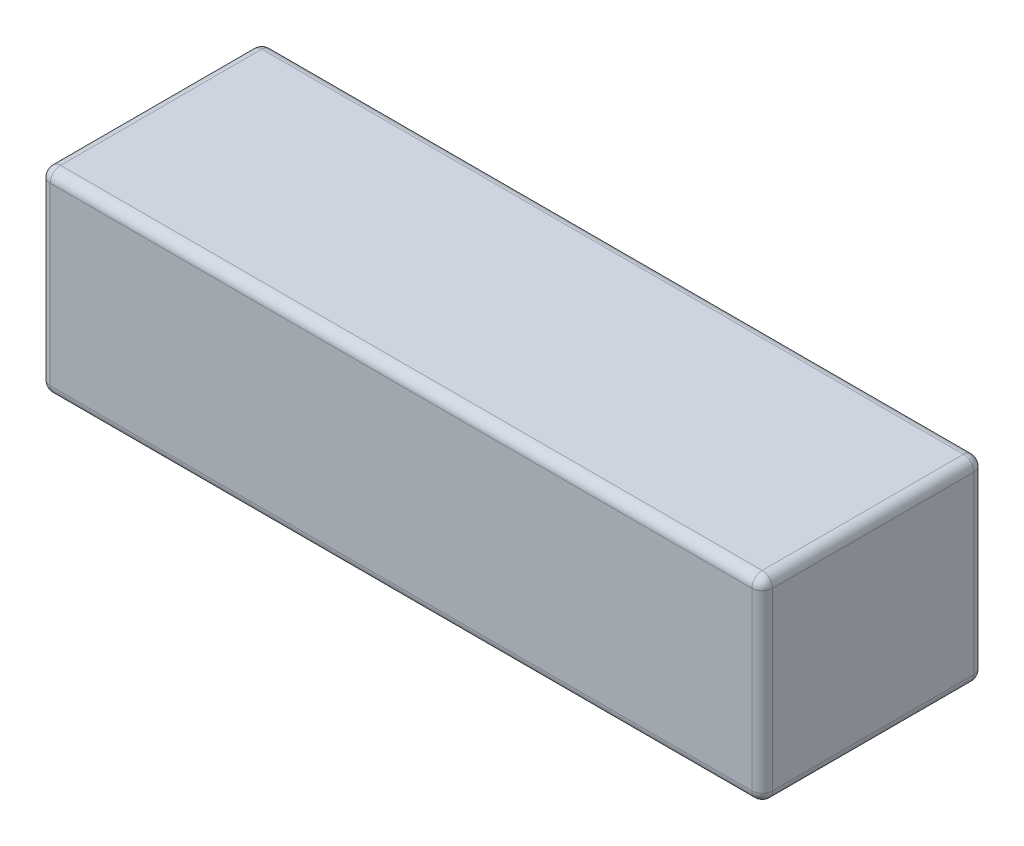
ISO-10303-21;
HEADER;
FILE_DESCRIPTION(('STEP AP214'),'2;1');
FILE_NAME('part.step','',(''),(''),'','','');
FILE_SCHEMA(('AUTOMOTIVE_DESIGN { 1 0 10303 214 1 1 1 1 }'));
ENDSEC;
DATA;
#1=APPLICATION_CONTEXT('core data for automotive mechanical design processes');
#2=APPLICATION_PROTOCOL_DEFINITION('international standard','automotive_design',2000,#1);
#3=PRODUCT_CONTEXT('',#1,'mechanical');
#4=PRODUCT('Part','Part','',(#3));
#5=PRODUCT_RELATED_PRODUCT_CATEGORY('part','',(#4));
#6=PRODUCT_DEFINITION_FORMATION('','',#4);
#7=PRODUCT_DEFINITION_CONTEXT('part definition',#1,'design');
#8=PRODUCT_DEFINITION('design','',#6,#7);
#9=PRODUCT_DEFINITION_SHAPE('','',#8);
#10=(LENGTH_UNIT() NAMED_UNIT(*) SI_UNIT(.MILLI.,.METRE.));
#11=(NAMED_UNIT(*) PLANE_ANGLE_UNIT() SI_UNIT($,.RADIAN.));
#12=(NAMED_UNIT(*) SI_UNIT($,.STERADIAN.) SOLID_ANGLE_UNIT());
#13=UNCERTAINTY_MEASURE_WITH_UNIT(LENGTH_MEASURE(1.E-05),#10,'distance_accuracy_value','');
#14=(GEOMETRIC_REPRESENTATION_CONTEXT(3) GLOBAL_UNCERTAINTY_ASSIGNED_CONTEXT((#13)) GLOBAL_UNIT_ASSIGNED_CONTEXT((#10,
#11,#12)) REPRESENTATION_CONTEXT('',''));
#15=CARTESIAN_POINT('',(0.,0.,0.));
#16=DIRECTION('',(0.,0.,1.));
#17=DIRECTION('',(1.,0.,0.));
#18=AXIS2_PLACEMENT_3D('',#15,#16,#17);
#19=CARTESIAN_POINT('',(70.,38.,21.5));
#20=DIRECTION('',(-1.,0.,0.));
#21=DIRECTION('',(0.,0.,1.));
#22=AXIS2_PLACEMENT_3D('',#19,#20,#21);
#23=PLANE('',#22);
#24=DIRECTION('',(0.,0.,-1.));
#25=VECTOR('',#24,1.);
#26=CARTESIAN_POINT('',(70.,36.,21.5));
#27=LINE('',#26,#25);
#28=CARTESIAN_POINT('',(70.,36.,-19.5));
#29=VERTEX_POINT('',#28);
#30=CARTESIAN_POINT('',(70.,36.,19.5));
#31=VERTEX_POINT('',#30);
#32=EDGE_CURVE('E194',#29,#31,#27,.F.);
#33=ORIENTED_EDGE('',*,*,#32,.T.);
#34=DIRECTION('',(0.,-1.,0.));
#35=VECTOR('',#34,1.);
#36=CARTESIAN_POINT('',(70.,38.,19.5));
#37=LINE('',#36,#35);
#38=CARTESIAN_POINT('',(70.,2.,19.5));
#39=VERTEX_POINT('',#38);
#40=EDGE_CURVE('E196',#31,#39,#37,.T.);
#41=ORIENTED_EDGE('',*,*,#40,.T.);
#42=DIRECTION('',(0.,0.,-1.));
#43=VECTOR('',#42,1.);
#44=CARTESIAN_POINT('',(70.,2.,-21.5));
#45=LINE('',#44,#43);
#46=CARTESIAN_POINT('',(70.,2.,-19.5));
#47=VERTEX_POINT('',#46);
#48=EDGE_CURVE('E190',#39,#47,#45,.T.);
#49=ORIENTED_EDGE('',*,*,#48,.T.);
#50=DIRECTION('',(0.,-1.,0.));
#51=VECTOR('',#50,1.);
#52=CARTESIAN_POINT('',(70.,38.,-19.5));
#53=LINE('',#52,#51);
#54=EDGE_CURVE('E192',#47,#29,#53,.F.);
#55=ORIENTED_EDGE('',*,*,#54,.T.);
#56=EDGE_LOOP('',(#33,#41,#49,#55));
#57=FACE_BOUND('',#56,.T.);
#58=ADVANCED_FACE('F34',(#57),#23,.F.);
#59=CARTESIAN_POINT('',(-70.,38.,-21.5));
#60=DIRECTION('',(0.,0.,1.));
#61=DIRECTION('',(1.,0.,0.));
#62=AXIS2_PLACEMENT_3D('',#59,#60,#61);
#63=PLANE('',#62);
#64=DIRECTION('',(-1.,0.,0.));
#65=VECTOR('',#64,1.);
#66=CARTESIAN_POINT('',(-70.,36.,-21.5));
#67=LINE('',#66,#65);
#68=CARTESIAN_POINT('',(-68.,36.,-21.5));
#69=VERTEX_POINT('',#68);
#70=CARTESIAN_POINT('',(68.,36.,-21.5));
#71=VERTEX_POINT('',#70);
#72=EDGE_CURVE('E141',#69,#71,#67,.F.);
#73=ORIENTED_EDGE('',*,*,#72,.T.);
#74=DIRECTION('',(0.,-1.,0.));
#75=VECTOR('',#74,1.);
#76=CARTESIAN_POINT('',(68.,38.,-21.5));
#77=LINE('',#76,#75);
#78=CARTESIAN_POINT('',(68.,2.,-21.5));
#79=VERTEX_POINT('',#78);
#80=EDGE_CURVE('E188',#71,#79,#77,.T.);
#81=ORIENTED_EDGE('',*,*,#80,.T.);
#82=DIRECTION('',(-1.,0.,0.));
#83=VECTOR('',#82,1.);
#84=CARTESIAN_POINT('',(-70.,2.,-21.5));
#85=LINE('',#84,#83);
#86=CARTESIAN_POINT('',(-68.,2.,-21.5));
#87=VERTEX_POINT('',#86);
#88=EDGE_CURVE('E185',#79,#87,#85,.T.);
#89=ORIENTED_EDGE('',*,*,#88,.T.);
#90=DIRECTION('',(0.,-1.,0.));
#91=VECTOR('',#90,1.);
#92=CARTESIAN_POINT('',(-68.,38.,-21.5));
#93=LINE('',#92,#91);
#94=EDGE_CURVE('E183',#87,#69,#93,.F.);
#95=ORIENTED_EDGE('',*,*,#94,.T.);
#96=EDGE_LOOP('',(#73,#81,#89,#95));
#97=FACE_BOUND('',#96,.T.);
#98=ADVANCED_FACE('F296',(#97),#63,.F.);
#99=CARTESIAN_POINT('',(-70.,38.,21.5));
#100=DIRECTION('',(1.,0.,0.));
#101=DIRECTION('',(0.,0.,-1.));
#102=AXIS2_PLACEMENT_3D('',#99,#100,#101);
#103=PLANE('',#102);
#104=DIRECTION('',(0.,0.,1.));
#105=VECTOR('',#104,1.);
#106=CARTESIAN_POINT('',(-70.,36.,21.5));
#107=LINE('',#106,#105);
#108=CARTESIAN_POINT('',(-70.,36.,19.5));
#109=VERTEX_POINT('',#108);
#110=CARTESIAN_POINT('',(-70.,36.,-19.5));
#111=VERTEX_POINT('',#110);
#112=EDGE_CURVE('E43',#109,#111,#107,.F.);
#113=ORIENTED_EDGE('',*,*,#112,.T.);
#114=DIRECTION('',(0.,-1.,0.));
#115=VECTOR('',#114,1.);
#116=CARTESIAN_POINT('',(-70.,38.,-19.5));
#117=LINE('',#116,#115);
#118=CARTESIAN_POINT('',(-70.,2.,-19.5));
#119=VERTEX_POINT('',#118);
#120=EDGE_CURVE('E11',#111,#119,#117,.T.);
#121=ORIENTED_EDGE('',*,*,#120,.T.);
#122=DIRECTION('',(0.,0.,1.));
#123=VECTOR('',#122,1.);
#124=CARTESIAN_POINT('',(-70.,2.,21.5));
#125=LINE('',#124,#123);
#126=CARTESIAN_POINT('',(-70.,2.,19.5));
#127=VERTEX_POINT('',#126);
#128=EDGE_CURVE('E199',#119,#127,#125,.T.);
#129=ORIENTED_EDGE('',*,*,#128,.T.);
#130=DIRECTION('',(0.,-1.,0.));
#131=VECTOR('',#130,1.);
#132=CARTESIAN_POINT('',(-70.,38.,19.5));
#133=LINE('',#132,#131);
#134=EDGE_CURVE('E54',#127,#109,#133,.F.);
#135=ORIENTED_EDGE('',*,*,#134,.T.);
#136=EDGE_LOOP('',(#113,#121,#129,#135));
#137=FACE_BOUND('',#136,.T.);
#138=ADVANCED_FACE('F298',(#137),#103,.F.);
#139=CARTESIAN_POINT('',(-70.,38.,21.5));
#140=DIRECTION('',(0.,0.,-1.));
#141=DIRECTION('',(-1.,0.,0.));
#142=AXIS2_PLACEMENT_3D('',#139,#140,#141);
#143=PLANE('',#142);
#144=DIRECTION('',(1.,0.,0.));
#145=VECTOR('',#144,1.);
#146=CARTESIAN_POINT('',(70.,2.,21.5));
#147=LINE('',#146,#145);
#148=CARTESIAN_POINT('',(-68.,2.,21.5));
#149=VERTEX_POINT('',#148);
#150=CARTESIAN_POINT('',(68.,2.,21.5));
#151=VERTEX_POINT('',#150);
#152=EDGE_CURVE('E167',#149,#151,#147,.T.);
#153=ORIENTED_EDGE('',*,*,#152,.T.);
#154=DIRECTION('',(0.,-1.,0.));
#155=VECTOR('',#154,1.);
#156=CARTESIAN_POINT('',(68.,38.,21.5));
#157=LINE('',#156,#155);
#158=CARTESIAN_POINT('',(68.,36.,21.5));
#159=VERTEX_POINT('',#158);
#160=EDGE_CURVE('E172',#151,#159,#157,.F.);
#161=ORIENTED_EDGE('',*,*,#160,.T.);
#162=DIRECTION('',(1.,0.,0.));
#163=VECTOR('',#162,1.);
#164=CARTESIAN_POINT('',(-70.,36.,21.5));
#165=LINE('',#164,#163);
#166=CARTESIAN_POINT('',(-68.,36.,21.5));
#167=VERTEX_POINT('',#166);
#168=EDGE_CURVE('E169',#159,#167,#165,.F.);
#169=ORIENTED_EDGE('',*,*,#168,.T.);
#170=DIRECTION('',(0.,-1.,0.));
#171=VECTOR('',#170,1.);
#172=CARTESIAN_POINT('',(-68.,38.,21.5));
#173=LINE('',#172,#171);
#174=EDGE_CURVE('E165',#167,#149,#173,.T.);
#175=ORIENTED_EDGE('',*,*,#174,.T.);
#176=EDGE_LOOP('',(#153,#161,#169,#175));
#177=FACE_BOUND('',#176,.T.);
#178=ADVANCED_FACE('F304',(#177),#143,.F.);
#179=CARTESIAN_POINT('',(0.,38.,0.));
#180=DIRECTION('',(0.,-1.,0.));
#181=DIRECTION('',(0.,0.,-1.));
#182=AXIS2_PLACEMENT_3D('',#179,#180,#181);
#183=PLANE('',#182);
#184=DIRECTION('',(1.,0.,0.));
#185=VECTOR('',#184,1.);
#186=CARTESIAN_POINT('',(0.,38.,19.5));
#187=LINE('',#186,#185);
#188=CARTESIAN_POINT('',(-68.,38.,19.5));
#189=VERTEX_POINT('',#188);
#190=CARTESIAN_POINT('',(68.,38.,19.5));
#191=VERTEX_POINT('',#190);
#192=EDGE_CURVE('E133',#189,#191,#187,.T.);
#193=ORIENTED_EDGE('',*,*,#192,.T.);
#194=DIRECTION('',(0.,0.,-1.));
#195=VECTOR('',#194,1.);
#196=CARTESIAN_POINT('',(68.,38.,0.));
#197=LINE('',#196,#195);
#198=CARTESIAN_POINT('',(68.,38.,-19.5));
#199=VERTEX_POINT('',#198);
#200=EDGE_CURVE('E129',#191,#199,#197,.T.);
#201=ORIENTED_EDGE('',*,*,#200,.T.);
#202=DIRECTION('',(-1.,0.,0.));
#203=VECTOR('',#202,1.);
#204=CARTESIAN_POINT('',(0.,38.,-19.5));
#205=LINE('',#204,#203);
#206=CARTESIAN_POINT('',(-68.,38.,-19.5));
#207=VERTEX_POINT('',#206);
#208=EDGE_CURVE('E121',#199,#207,#205,.T.);
#209=ORIENTED_EDGE('',*,*,#208,.T.);
#210=DIRECTION('',(0.,0.,1.));
#211=VECTOR('',#210,1.);
#212=CARTESIAN_POINT('',(-68.,38.,0.));
#213=LINE('',#212,#211);
#214=EDGE_CURVE('E126',#207,#189,#213,.T.);
#215=ORIENTED_EDGE('',*,*,#214,.T.);
#216=EDGE_LOOP('',(#193,#201,#209,#215));
#217=FACE_BOUND('',#216,.T.);
#218=ADVANCED_FACE('F124',(#217),#183,.F.);
#219=CARTESIAN_POINT('',(0.,0.,0.));
#220=DIRECTION('',(0.,-1.,0.));
#221=DIRECTION('',(0.,0.,-1.));
#222=AXIS2_PLACEMENT_3D('',#219,#220,#221);
#223=PLANE('',#222);
#224=DIRECTION('',(-1.,0.,0.));
#225=VECTOR('',#224,1.);
#226=CARTESIAN_POINT('',(70.,0.,-19.5));
#227=LINE('',#226,#225);
#228=CARTESIAN_POINT('',(-68.,0.,-19.5));
#229=VERTEX_POINT('',#228);
#230=CARTESIAN_POINT('',(68.,0.,-19.5));
#231=VERTEX_POINT('',#230);
#232=EDGE_CURVE('E176',#229,#231,#227,.F.);
#233=ORIENTED_EDGE('',*,*,#232,.T.);
#234=DIRECTION('',(0.,0.,-1.));
#235=VECTOR('',#234,1.);
#236=CARTESIAN_POINT('',(68.,0.,21.5));
#237=LINE('',#236,#235);
#238=CARTESIAN_POINT('',(68.,0.,19.5));
#239=VERTEX_POINT('',#238);
#240=EDGE_CURVE('E181',#231,#239,#237,.F.);
#241=ORIENTED_EDGE('',*,*,#240,.T.);
#242=DIRECTION('',(1.,0.,0.));
#243=VECTOR('',#242,1.);
#244=CARTESIAN_POINT('',(-70.,0.,19.5));
#245=LINE('',#244,#243);
#246=CARTESIAN_POINT('',(-68.,0.,19.5));
#247=VERTEX_POINT('',#246);
#248=EDGE_CURVE('E178',#239,#247,#245,.F.);
#249=ORIENTED_EDGE('',*,*,#248,.T.);
#250=DIRECTION('',(0.,0.,1.));
#251=VECTOR('',#250,1.);
#252=CARTESIAN_POINT('',(-68.,0.,-21.5));
#253=LINE('',#252,#251);
#254=EDGE_CURVE('E174',#247,#229,#253,.F.);
#255=ORIENTED_EDGE('',*,*,#254,.T.);
#256=EDGE_LOOP('',(#233,#241,#249,#255));
#257=FACE_BOUND('',#256,.T.);
#258=ADVANCED_FACE('F274',(#257),#223,.T.);
#259=CARTESIAN_POINT('',(-70.,2.,-19.5));
#260=DIRECTION('',(1.,0.,0.));
#261=DIRECTION('',(0.,0.,-1.));
#262=AXIS2_PLACEMENT_3D('',#259,#260,#261);
#263=CYLINDRICAL_SURFACE('',#262,2.);
#264=CARTESIAN_POINT('',(-68.,2.,-19.5));
#265=DIRECTION('',(-1.,0.,0.));
#266=DIRECTION('',(0.,0.,1.));
#267=AXIS2_PLACEMENT_3D('',#264,#265,#266);
#268=CIRCLE('',#267,2.);
#269=EDGE_CURVE('E38',#87,#229,#268,.T.);
#270=ORIENTED_EDGE('',*,*,#269,.F.);
#271=ORIENTED_EDGE('',*,*,#88,.F.);
#272=CARTESIAN_POINT('',(68.,2.,-19.5));
#273=DIRECTION('',(1.,0.,0.));
#274=DIRECTION('',(0.,0.,-1.));
#275=AXIS2_PLACEMENT_3D('',#272,#273,#274);
#276=CIRCLE('',#275,2.);
#277=EDGE_CURVE('E161',#231,#79,#276,.T.);
#278=ORIENTED_EDGE('',*,*,#277,.F.);
#279=ORIENTED_EDGE('',*,*,#232,.F.);
#280=EDGE_LOOP('',(#270,#271,#278,#279));
#281=FACE_BOUND('',#280,.T.);
#282=ADVANCED_FACE('F36',(#281),#263,.T.);
#283=CARTESIAN_POINT('',(-68.,2.,-19.5));
#284=DIRECTION('',(0.,-1.,0.));
#285=DIRECTION('',(0.,0.,-1.));
#286=AXIS2_PLACEMENT_3D('',#283,#284,#285);
#287=SPHERICAL_SURFACE('',#286,2.);
#288=CARTESIAN_POINT('',(-68.,2.,-19.5));
#289=DIRECTION('',(0.,-1.,0.));
#290=DIRECTION('',(0.,0.,-1.));
#291=AXIS2_PLACEMENT_3D('',#288,#289,#290);
#292=CIRCLE('',#291,2.);
#293=EDGE_CURVE('E244',#87,#119,#292,.F.);
#294=ORIENTED_EDGE('',*,*,#293,.F.);
#295=ORIENTED_EDGE('',*,*,#269,.T.);
#296=CARTESIAN_POINT('',(-68.,2.,-19.5));
#297=DIRECTION('',(0.,0.,-1.));
#298=DIRECTION('',(-1.,0.,0.));
#299=AXIS2_PLACEMENT_3D('',#296,#297,#298);
#300=CIRCLE('',#299,2.);
#301=EDGE_CURVE('E247',#119,#229,#300,.F.);
#302=ORIENTED_EDGE('',*,*,#301,.F.);
#303=EDGE_LOOP('',(#294,#295,#302));
#304=FACE_BOUND('',#303,.T.);
#305=ADVANCED_FACE('F291',(#304),#287,.T.);
#306=CARTESIAN_POINT('',(68.,2.,-19.5));
#307=DIRECTION('',(0.,0.,-1.));
#308=DIRECTION('',(0.,1.,0.));
#309=AXIS2_PLACEMENT_3D('',#306,#307,#308);
#310=SPHERICAL_SURFACE('',#309,2.);
#311=CARTESIAN_POINT('',(68.,2.,-19.5));
#312=DIRECTION('',(0.,0.,-1.));
#313=DIRECTION('',(-1.,0.,0.));
#314=AXIS2_PLACEMENT_3D('',#311,#312,#313);
#315=CIRCLE('',#314,2.);
#316=EDGE_CURVE('E238',#231,#47,#315,.F.);
#317=ORIENTED_EDGE('',*,*,#316,.F.);
#318=ORIENTED_EDGE('',*,*,#277,.T.);
#319=CARTESIAN_POINT('',(68.,2.,-19.5));
#320=DIRECTION('',(0.,-1.,0.));
#321=DIRECTION('',(0.,0.,-1.));
#322=AXIS2_PLACEMENT_3D('',#319,#320,#321);
#323=CIRCLE('',#322,2.);
#324=EDGE_CURVE('E241',#47,#79,#323,.F.);
#325=ORIENTED_EDGE('',*,*,#324,.F.);
#326=EDGE_LOOP('',(#317,#318,#325));
#327=FACE_BOUND('',#326,.T.);
#328=ADVANCED_FACE('F254',(#327),#310,.T.);
#329=CARTESIAN_POINT('',(-68.,2.,21.5));
#330=DIRECTION('',(0.,0.,-1.));
#331=DIRECTION('',(-1.,0.,0.));
#332=AXIS2_PLACEMENT_3D('',#329,#330,#331);
#333=CYLINDRICAL_SURFACE('',#332,2.);
#334=ORIENTED_EDGE('',*,*,#301,.T.);
#335=ORIENTED_EDGE('',*,*,#254,.F.);
#336=CARTESIAN_POINT('',(-68.,2.,19.5));
#337=DIRECTION('',(0.,0.,1.));
#338=DIRECTION('',(1.,0.,0.));
#339=AXIS2_PLACEMENT_3D('',#336,#337,#338);
#340=CIRCLE('',#339,2.);
#341=EDGE_CURVE('E233',#127,#247,#340,.T.);
#342=ORIENTED_EDGE('',*,*,#341,.F.);
#343=ORIENTED_EDGE('',*,*,#128,.F.);
#344=EDGE_LOOP('',(#334,#335,#342,#343));
#345=FACE_BOUND('',#344,.T.);
#346=ADVANCED_FACE('F286',(#345),#333,.T.);
#347=CARTESIAN_POINT('',(-68.,38.,-19.5));
#348=DIRECTION('',(0.,-1.,0.));
#349=DIRECTION('',(0.,0.,-1.));
#350=AXIS2_PLACEMENT_3D('',#347,#348,#349);
#351=CYLINDRICAL_SURFACE('',#350,2.);
#352=ORIENTED_EDGE('',*,*,#293,.T.);
#353=ORIENTED_EDGE('',*,*,#120,.F.);
#354=CARTESIAN_POINT('',(-68.,36.,-19.5));
#355=DIRECTION('',(0.,1.,0.));
#356=DIRECTION('',(0.,0.,1.));
#357=AXIS2_PLACEMENT_3D('',#354,#355,#356);
#358=CIRCLE('',#357,2.);
#359=EDGE_CURVE('E145',#69,#111,#358,.T.);
#360=ORIENTED_EDGE('',*,*,#359,.F.);
#361=ORIENTED_EDGE('',*,*,#94,.F.);
#362=EDGE_LOOP('',(#352,#353,#360,#361));
#363=FACE_BOUND('',#362,.T.);
#364=ADVANCED_FACE('F294',(#363),#351,.T.);
#365=CARTESIAN_POINT('',(0.,36.,-19.5));
#366=DIRECTION('',(-1.,0.,0.));
#367=DIRECTION('',(0.,0.,1.));
#368=AXIS2_PLACEMENT_3D('',#365,#366,#367);
#369=CYLINDRICAL_SURFACE('',#368,2.);
#370=CARTESIAN_POINT('',(68.,36.,-19.5));
#371=DIRECTION('',(1.,0.,0.));
#372=DIRECTION('',(0.,0.,-1.));
#373=AXIS2_PLACEMENT_3D('',#370,#371,#372);
#374=CIRCLE('',#373,2.);
#375=EDGE_CURVE('E146',#71,#199,#374,.T.);
#376=ORIENTED_EDGE('',*,*,#375,.F.);
#377=ORIENTED_EDGE('',*,*,#72,.F.);
#378=CARTESIAN_POINT('',(-68.,36.,-19.5));
#379=DIRECTION('',(-1.,0.,0.));
#380=DIRECTION('',(0.,0.,1.));
#381=AXIS2_PLACEMENT_3D('',#378,#379,#380);
#382=CIRCLE('',#381,2.);
#383=EDGE_CURVE('E137',#207,#69,#382,.T.);
#384=ORIENTED_EDGE('',*,*,#383,.F.);
#385=ORIENTED_EDGE('',*,*,#208,.F.);
#386=EDGE_LOOP('',(#376,#377,#384,#385));
#387=FACE_BOUND('',#386,.T.);
#388=ADVANCED_FACE('F139',(#387),#369,.T.);
#389=CARTESIAN_POINT('',(68.,38.,-19.5));
#390=DIRECTION('',(0.,-1.,0.));
#391=DIRECTION('',(0.,0.,-1.));
#392=AXIS2_PLACEMENT_3D('',#389,#390,#391);
#393=CYLINDRICAL_SURFACE('',#392,2.);
#394=ORIENTED_EDGE('',*,*,#324,.T.);
#395=ORIENTED_EDGE('',*,*,#80,.F.);
#396=CARTESIAN_POINT('',(68.,36.,-19.5));
#397=DIRECTION('',(0.,1.,0.));
#398=DIRECTION('',(0.,0.,1.));
#399=AXIS2_PLACEMENT_3D('',#396,#397,#398);
#400=CIRCLE('',#399,2.);
#401=EDGE_CURVE('E229',#29,#71,#400,.T.);
#402=ORIENTED_EDGE('',*,*,#401,.F.);
#403=ORIENTED_EDGE('',*,*,#54,.F.);
#404=EDGE_LOOP('',(#394,#395,#402,#403));
#405=FACE_BOUND('',#404,.T.);
#406=ADVANCED_FACE('F262',(#405),#393,.T.);
#407=CARTESIAN_POINT('',(68.,2.,21.5));
#408=DIRECTION('',(0.,0.,1.));
#409=DIRECTION('',(1.,0.,0.));
#410=AXIS2_PLACEMENT_3D('',#407,#408,#409);
#411=CYLINDRICAL_SURFACE('',#410,2.);
#412=ORIENTED_EDGE('',*,*,#316,.T.);
#413=ORIENTED_EDGE('',*,*,#48,.F.);
#414=CARTESIAN_POINT('',(68.,2.,19.5));
#415=DIRECTION('',(0.,0.,1.));
#416=DIRECTION('',(1.,0.,0.));
#417=AXIS2_PLACEMENT_3D('',#414,#415,#416);
#418=CIRCLE('',#417,2.);
#419=EDGE_CURVE('E226',#239,#39,#418,.T.);
#420=ORIENTED_EDGE('',*,*,#419,.F.);
#421=ORIENTED_EDGE('',*,*,#240,.F.);
#422=EDGE_LOOP('',(#412,#413,#420,#421));
#423=FACE_BOUND('',#422,.T.);
#424=ADVANCED_FACE('F271',(#423),#411,.T.);
#425=CARTESIAN_POINT('',(-70.,2.,19.5));
#426=DIRECTION('',(-1.,0.,0.));
#427=DIRECTION('',(0.,0.,1.));
#428=AXIS2_PLACEMENT_3D('',#425,#426,#427);
#429=CYLINDRICAL_SURFACE('',#428,2.);
#430=CARTESIAN_POINT('',(-68.,2.,19.5));
#431=DIRECTION('',(-1.,0.,0.));
#432=DIRECTION('',(0.,0.,1.));
#433=AXIS2_PLACEMENT_3D('',#430,#431,#432);
#434=CIRCLE('',#433,2.);
#435=EDGE_CURVE('E235',#247,#149,#434,.T.);
#436=ORIENTED_EDGE('',*,*,#435,.F.);
#437=ORIENTED_EDGE('',*,*,#248,.F.);
#438=CARTESIAN_POINT('',(68.,2.,19.5));
#439=DIRECTION('',(1.,0.,0.));
#440=DIRECTION('',(0.,0.,-1.));
#441=AXIS2_PLACEMENT_3D('',#438,#439,#440);
#442=CIRCLE('',#441,2.);
#443=EDGE_CURVE('E223',#151,#239,#442,.T.);
#444=ORIENTED_EDGE('',*,*,#443,.F.);
#445=ORIENTED_EDGE('',*,*,#152,.F.);
#446=EDGE_LOOP('',(#436,#437,#444,#445));
#447=FACE_BOUND('',#446,.T.);
#448=ADVANCED_FACE('F278',(#447),#429,.T.);
#449=CARTESIAN_POINT('',(-68.,2.,19.5));
#450=DIRECTION('',(0.,-1.,0.));
#451=DIRECTION('',(0.,0.,-1.));
#452=AXIS2_PLACEMENT_3D('',#449,#450,#451);
#453=SPHERICAL_SURFACE('',#452,2.);
#454=ORIENTED_EDGE('',*,*,#341,.T.);
#455=ORIENTED_EDGE('',*,*,#435,.T.);
#456=CARTESIAN_POINT('',(-68.,2.,19.5));
#457=DIRECTION('',(0.,-1.,0.));
#458=DIRECTION('',(0.,0.,-1.));
#459=AXIS2_PLACEMENT_3D('',#456,#457,#458);
#460=CIRCLE('',#459,2.);
#461=EDGE_CURVE('E152',#127,#149,#460,.F.);
#462=ORIENTED_EDGE('',*,*,#461,.F.);
#463=EDGE_LOOP('',(#454,#455,#462));
#464=FACE_BOUND('',#463,.T.);
#465=ADVANCED_FACE('F345',(#464),#453,.T.);
#466=CARTESIAN_POINT('',(-68.,36.,-19.5));
#467=DIRECTION('',(0.,0.,-1.));
#468=DIRECTION('',(-1.,0.,0.));
#469=AXIS2_PLACEMENT_3D('',#466,#467,#468);
#470=SPHERICAL_SURFACE('',#469,2.);
#471=ORIENTED_EDGE('',*,*,#383,.T.);
#472=ORIENTED_EDGE('',*,*,#359,.T.);
#473=CARTESIAN_POINT('',(-68.,36.,-19.5));
#474=DIRECTION('',(0.,0.,-1.));
#475=DIRECTION('',(-1.,0.,0.));
#476=AXIS2_PLACEMENT_3D('',#473,#474,#475);
#477=CIRCLE('',#476,2.);
#478=EDGE_CURVE('E149',#207,#111,#477,.F.);
#479=ORIENTED_EDGE('',*,*,#478,.F.);
#480=EDGE_LOOP('',(#471,#472,#479));
#481=FACE_BOUND('',#480,.T.);
#482=ADVANCED_FACE('F150',(#481),#470,.T.);
#483=CARTESIAN_POINT('',(68.,36.,-19.5));
#484=DIRECTION('',(0.,0.,-1.));
#485=DIRECTION('',(-1.,0.,0.));
#486=AXIS2_PLACEMENT_3D('',#483,#484,#485);
#487=SPHERICAL_SURFACE('',#486,2.);
#488=ORIENTED_EDGE('',*,*,#401,.T.);
#489=ORIENTED_EDGE('',*,*,#375,.T.);
#490=CARTESIAN_POINT('',(68.,36.,-19.5));
#491=DIRECTION('',(0.,0.,-1.));
#492=DIRECTION('',(-1.,0.,0.));
#493=AXIS2_PLACEMENT_3D('',#490,#491,#492);
#494=CIRCLE('',#493,2.);
#495=EDGE_CURVE('E153',#29,#199,#494,.F.);
#496=ORIENTED_EDGE('',*,*,#495,.F.);
#497=EDGE_LOOP('',(#488,#489,#496));
#498=FACE_BOUND('',#497,.T.);
#499=ADVANCED_FACE('F338',(#498),#487,.T.);
#500=CARTESIAN_POINT('',(68.,2.,19.5));
#501=DIRECTION('',(0.,-1.,0.));
#502=DIRECTION('',(0.,0.,-1.));
#503=AXIS2_PLACEMENT_3D('',#500,#501,#502);
#504=SPHERICAL_SURFACE('',#503,2.);
#505=ORIENTED_EDGE('',*,*,#443,.T.);
#506=ORIENTED_EDGE('',*,*,#419,.T.);
#507=CARTESIAN_POINT('',(68.,2.,19.5));
#508=DIRECTION('',(0.,-1.,0.));
#509=DIRECTION('',(0.,0.,-1.));
#510=AXIS2_PLACEMENT_3D('',#507,#508,#509);
#511=CIRCLE('',#510,2.);
#512=EDGE_CURVE('E217',#151,#39,#511,.F.);
#513=ORIENTED_EDGE('',*,*,#512,.F.);
#514=EDGE_LOOP('',(#505,#506,#513));
#515=FACE_BOUND('',#514,.T.);
#516=ADVANCED_FACE('F334',(#515),#504,.T.);
#517=CARTESIAN_POINT('',(-68.,38.,19.5));
#518=DIRECTION('',(0.,-1.,0.));
#519=DIRECTION('',(0.,0.,-1.));
#520=AXIS2_PLACEMENT_3D('',#517,#518,#519);
#521=CYLINDRICAL_SURFACE('',#520,2.);
#522=ORIENTED_EDGE('',*,*,#461,.T.);
#523=ORIENTED_EDGE('',*,*,#174,.F.);
#524=CARTESIAN_POINT('',(-68.,36.,19.5));
#525=DIRECTION('',(0.,1.,0.));
#526=DIRECTION('',(0.,0.,1.));
#527=AXIS2_PLACEMENT_3D('',#524,#525,#526);
#528=CIRCLE('',#527,2.);
#529=EDGE_CURVE('E214',#109,#167,#528,.T.);
#530=ORIENTED_EDGE('',*,*,#529,.F.);
#531=ORIENTED_EDGE('',*,*,#134,.F.);
#532=EDGE_LOOP('',(#522,#523,#530,#531));
#533=FACE_BOUND('',#532,.T.);
#534=ADVANCED_FACE('F331',(#533),#521,.T.);
#535=CARTESIAN_POINT('',(-68.,36.,0.));
#536=DIRECTION('',(0.,0.,1.));
#537=DIRECTION('',(1.,0.,0.));
#538=AXIS2_PLACEMENT_3D('',#535,#536,#537);
#539=CYLINDRICAL_SURFACE('',#538,2.);
#540=ORIENTED_EDGE('',*,*,#478,.T.);
#541=ORIENTED_EDGE('',*,*,#112,.F.);
#542=CARTESIAN_POINT('',(-68.,36.,19.5));
#543=DIRECTION('',(0.,0.,1.));
#544=DIRECTION('',(1.,0.,0.));
#545=AXIS2_PLACEMENT_3D('',#542,#543,#544);
#546=CIRCLE('',#545,2.);
#547=EDGE_CURVE('E157',#189,#109,#546,.T.);
#548=ORIENTED_EDGE('',*,*,#547,.F.);
#549=ORIENTED_EDGE('',*,*,#214,.F.);
#550=EDGE_LOOP('',(#540,#541,#548,#549));
#551=FACE_BOUND('',#550,.T.);
#552=ADVANCED_FACE('F155',(#551),#539,.T.);
#553=CARTESIAN_POINT('',(68.,36.,0.));
#554=DIRECTION('',(0.,0.,-1.));
#555=DIRECTION('',(-1.,0.,0.));
#556=AXIS2_PLACEMENT_3D('',#553,#554,#555);
#557=CYLINDRICAL_SURFACE('',#556,2.);
#558=ORIENTED_EDGE('',*,*,#495,.T.);
#559=ORIENTED_EDGE('',*,*,#200,.F.);
#560=CARTESIAN_POINT('',(68.,36.,19.5));
#561=DIRECTION('',(0.,0.,1.));
#562=DIRECTION('',(1.,0.,0.));
#563=AXIS2_PLACEMENT_3D('',#560,#561,#562);
#564=CIRCLE('',#563,2.);
#565=EDGE_CURVE('E210',#31,#191,#564,.T.);
#566=ORIENTED_EDGE('',*,*,#565,.F.);
#567=ORIENTED_EDGE('',*,*,#32,.F.);
#568=EDGE_LOOP('',(#558,#559,#566,#567));
#569=FACE_BOUND('',#568,.T.);
#570=ADVANCED_FACE('F324',(#569),#557,.T.);
#571=CARTESIAN_POINT('',(68.,38.,19.5));
#572=DIRECTION('',(0.,-1.,0.));
#573=DIRECTION('',(0.,0.,-1.));
#574=AXIS2_PLACEMENT_3D('',#571,#572,#573);
#575=CYLINDRICAL_SURFACE('',#574,2.);
#576=ORIENTED_EDGE('',*,*,#512,.T.);
#577=ORIENTED_EDGE('',*,*,#40,.F.);
#578=CARTESIAN_POINT('',(68.,36.,19.5));
#579=DIRECTION('',(0.,1.,0.));
#580=DIRECTION('',(0.,0.,1.));
#581=AXIS2_PLACEMENT_3D('',#578,#579,#580);
#582=CIRCLE('',#581,2.);
#583=EDGE_CURVE('E207',#159,#31,#582,.T.);
#584=ORIENTED_EDGE('',*,*,#583,.F.);
#585=ORIENTED_EDGE('',*,*,#160,.F.);
#586=EDGE_LOOP('',(#576,#577,#584,#585));
#587=FACE_BOUND('',#586,.T.);
#588=ADVANCED_FACE('F320',(#587),#575,.T.);
#589=CARTESIAN_POINT('',(-68.,36.,19.5));
#590=DIRECTION('',(-1.,0.,0.));
#591=DIRECTION('',(0.,0.,1.));
#592=AXIS2_PLACEMENT_3D('',#589,#590,#591);
#593=SPHERICAL_SURFACE('',#592,2.);
#594=ORIENTED_EDGE('',*,*,#547,.T.);
#595=ORIENTED_EDGE('',*,*,#529,.T.);
#596=CARTESIAN_POINT('',(-68.,36.,19.5));
#597=DIRECTION('',(-1.,0.,0.));
#598=DIRECTION('',(0.,0.,1.));
#599=AXIS2_PLACEMENT_3D('',#596,#597,#598);
#600=CIRCLE('',#599,2.);
#601=EDGE_CURVE('E205',#189,#167,#600,.F.);
#602=ORIENTED_EDGE('',*,*,#601,.F.);
#603=EDGE_LOOP('',(#594,#595,#602));
#604=FACE_BOUND('',#603,.T.);
#605=ADVANCED_FACE('F316',(#604),#593,.T.);
#606=CARTESIAN_POINT('',(68.,36.,19.5));
#607=DIRECTION('',(1.,0.,0.));
#608=DIRECTION('',(0.,0.,-1.));
#609=AXIS2_PLACEMENT_3D('',#606,#607,#608);
#610=SPHERICAL_SURFACE('',#609,2.);
#611=ORIENTED_EDGE('',*,*,#583,.T.);
#612=ORIENTED_EDGE('',*,*,#565,.T.);
#613=CARTESIAN_POINT('',(68.,36.,19.5));
#614=DIRECTION('',(1.,0.,0.));
#615=DIRECTION('',(0.,0.,-1.));
#616=AXIS2_PLACEMENT_3D('',#613,#614,#615);
#617=CIRCLE('',#616,2.);
#618=EDGE_CURVE('E203',#159,#191,#617,.F.);
#619=ORIENTED_EDGE('',*,*,#618,.F.);
#620=EDGE_LOOP('',(#611,#612,#619));
#621=FACE_BOUND('',#620,.T.);
#622=ADVANCED_FACE('F312',(#621),#610,.T.);
#623=CARTESIAN_POINT('',(0.,36.,19.5));
#624=DIRECTION('',(1.,0.,0.));
#625=DIRECTION('',(0.,0.,-1.));
#626=AXIS2_PLACEMENT_3D('',#623,#624,#625);
#627=CYLINDRICAL_SURFACE('',#626,2.);
#628=ORIENTED_EDGE('',*,*,#601,.T.);
#629=ORIENTED_EDGE('',*,*,#168,.F.);
#630=ORIENTED_EDGE('',*,*,#618,.T.);
#631=ORIENTED_EDGE('',*,*,#192,.F.);
#632=EDGE_LOOP('',(#628,#629,#630,#631));
#633=FACE_BOUND('',#632,.T.);
#634=ADVANCED_FACE('F309',(#633),#627,.T.);
#635=CLOSED_SHELL('',(#58,#98,#138,#178,#218,#258,#282,#305,#328,#346,#364,#388,#406,#424,#448,
#465,#482,#499,#516,#534,#552,#570,#588,#605,#622,#634));
#636=MANIFOLD_SOLID_BREP('B2',#635);
#637=ADVANCED_BREP_SHAPE_REPRESENTATION('',(#18,#636),#14);
#638=SHAPE_DEFINITION_REPRESENTATION(#9,#637);
ENDSEC;
END-ISO-10303-21;
